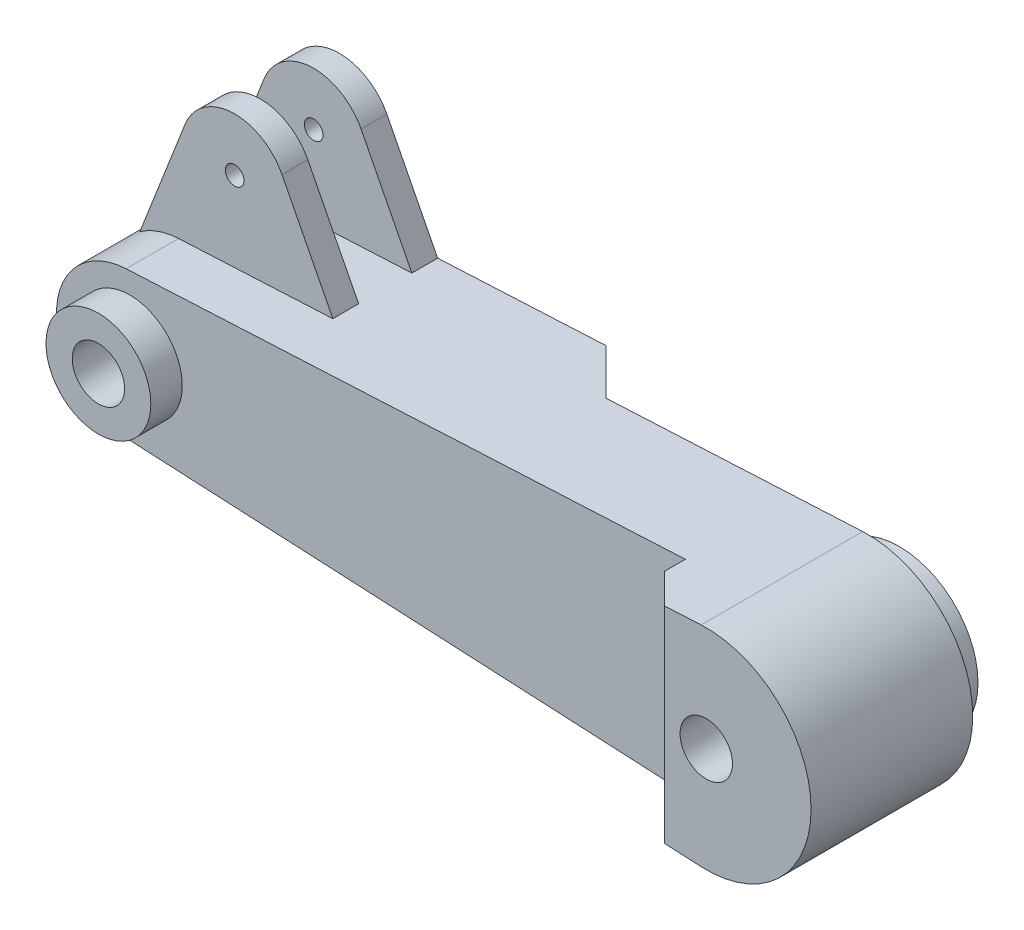
ISO-10303-21;
HEADER;
FILE_DESCRIPTION(('STEP AP214'),'2;1');
FILE_NAME('part.step','',(''),(''),'','','');
FILE_SCHEMA(('AUTOMOTIVE_DESIGN { 1 0 10303 214 1 1 1 1 }'));
ENDSEC;
DATA;
#1=APPLICATION_CONTEXT('core data for automotive mechanical design processes');
#2=APPLICATION_PROTOCOL_DEFINITION('international standard','automotive_design',2000,#1);
#3=PRODUCT_CONTEXT('',#1,'mechanical');
#4=PRODUCT('Part','Part','',(#3));
#5=PRODUCT_RELATED_PRODUCT_CATEGORY('part','',(#4));
#6=PRODUCT_DEFINITION_FORMATION('','',#4);
#7=PRODUCT_DEFINITION_CONTEXT('part definition',#1,'design');
#8=PRODUCT_DEFINITION('design','',#6,#7);
#9=PRODUCT_DEFINITION_SHAPE('','',#8);
#10=(LENGTH_UNIT() NAMED_UNIT(*) SI_UNIT(.MILLI.,.METRE.));
#11=(NAMED_UNIT(*) PLANE_ANGLE_UNIT() SI_UNIT($,.RADIAN.));
#12=(NAMED_UNIT(*) SI_UNIT($,.STERADIAN.) SOLID_ANGLE_UNIT());
#13=UNCERTAINTY_MEASURE_WITH_UNIT(LENGTH_MEASURE(1.E-05),#10,'distance_accuracy_value','');
#14=(GEOMETRIC_REPRESENTATION_CONTEXT(3) GLOBAL_UNCERTAINTY_ASSIGNED_CONTEXT((#13)) GLOBAL_UNIT_ASSIGNED_CONTEXT((#10,
#11,#12)) REPRESENTATION_CONTEXT('',''));
#15=CARTESIAN_POINT('',(0.,0.,0.));
#16=DIRECTION('',(0.,0.,1.));
#17=DIRECTION('',(1.,0.,0.));
#18=AXIS2_PLACEMENT_3D('',#15,#16,#17);
#19=CARTESIAN_POINT('',(-67.,-10.,15.));
#20=DIRECTION('',(0.,0.,-1.));
#21=DIRECTION('',(-1.,0.,0.));
#22=AXIS2_PLACEMENT_3D('',#19,#20,#21);
#23=PLANE('',#22);
#24=CARTESIAN_POINT('',(-60.,0.,15.));
#25=DIRECTION('',(0.,0.,-1.));
#26=DIRECTION('',(-1.,0.,0.));
#27=AXIS2_PLACEMENT_3D('',#24,#25,#26);
#28=CIRCLE('',#27,7.);
#29=CARTESIAN_POINT('',(-60.35,-6.99124452440336,15.));
#30=VERTEX_POINT('',#29);
#31=CARTESIAN_POINT('',(-60.35,6.99124452440336,15.));
#32=VERTEX_POINT('',#31);
#33=EDGE_CURVE('E191',#30,#32,#28,.T.);
#34=ORIENTED_EDGE('',*,*,#33,.F.);
#35=DIRECTION('',(-0.998749217771909,0.0500000000000001,0.));
#36=VECTOR('',#35,1.);
#37=CARTESIAN_POINT('',(-60.35,-6.99124452440336,15.));
#38=LINE('',#37,#36);
#39=CARTESIAN_POINT('',(-7.00000000000001,-9.66208516440995,15.));
#40=VERTEX_POINT('',#39);
#41=EDGE_CURVE('E174',#40,#30,#38,.T.);
#42=ORIENTED_EDGE('',*,*,#41,.F.);
#43=DIRECTION('',(0.,1.,0.));
#44=VECTOR('',#43,1.);
#45=CARTESIAN_POINT('',(-7.00000000000001,-10.,15.));
#46=LINE('',#45,#44);
#47=CARTESIAN_POINT('',(-7.00000000000001,9.66208516440995,15.));
#48=VERTEX_POINT('',#47);
#49=EDGE_CURVE('E188',#40,#48,#46,.T.);
#50=ORIENTED_EDGE('',*,*,#49,.T.);
#51=DIRECTION('',(0.998749217771909,0.0500000000000001,0.));
#52=VECTOR('',#51,1.);
#53=CARTESIAN_POINT('',(-60.35,6.99124452440336,15.));
#54=LINE('',#53,#52);
#55=EDGE_CURVE('E206',#32,#48,#54,.T.);
#56=ORIENTED_EDGE('',*,*,#55,.F.);
#57=EDGE_LOOP('',(#34,#42,#50,#56));
#58=FACE_BOUND('',#57,.T.);
#59=CARTESIAN_POINT('',(-60.,0.,15.));
#60=DIRECTION('',(0.,0.,-1.));
#61=DIRECTION('',(-1.,0.,0.));
#62=AXIS2_PLACEMENT_3D('',#59,#60,#61);
#63=CIRCLE('',#62,5.);
#64=CARTESIAN_POINT('',(-65.,0.,15.));
#65=VERTEX_POINT('',#64);
#66=EDGE_CURVE('E381',#65,#65,#63,.F.);
#67=ORIENTED_EDGE('',*,*,#66,.F.);
#68=EDGE_LOOP('',(#67));
#69=FACE_BOUND('',#68,.T.);
#70=ADVANCED_FACE('F51',(#58,#69),#23,.F.);
#71=CARTESIAN_POINT('',(-30.,-10.,4.572));
#72=DIRECTION('',(0.,0.,1.));
#73=DIRECTION('',(1.,0.,0.));
#74=AXIS2_PLACEMENT_3D('',#71,#72,#73);
#75=PLANE('',#74);
#76=DIRECTION('',(0.998749217771909,-0.0500000000000001,0.));
#77=VECTOR('',#76,1.);
#78=CARTESIAN_POINT('',(-60.35,-6.99124452440336,4.572));
#79=LINE('',#78,#77);
#80=CARTESIAN_POINT('',(-24.9999999999999,-8.76095805063079,4.572));
#81=VERTEX_POINT('',#80);
#82=CARTESIAN_POINT('',(-0.500000000000005,-9.98749217771909,4.572));
#83=VERTEX_POINT('',#82);
#84=EDGE_CURVE('E213',#81,#83,#79,.T.);
#85=ORIENTED_EDGE('',*,*,#84,.F.);
#86=DIRECTION('',(0.,1.,0.));
#87=VECTOR('',#86,1.);
#88=CARTESIAN_POINT('',(-24.9999999999999,8.5106449634699,4.572));
#89=LINE('',#88,#87);
#90=CARTESIAN_POINT('',(-24.9999999999999,8.76095805063079,4.572));
#91=VERTEX_POINT('',#90);
#92=EDGE_CURVE('E366',#81,#91,#89,.T.);
#93=ORIENTED_EDGE('',*,*,#92,.T.);
#94=DIRECTION('',(-0.998749217771909,-0.0500000000000001,0.));
#95=VECTOR('',#94,1.);
#96=CARTESIAN_POINT('',(-60.35,6.99124452440336,4.572));
#97=LINE('',#96,#95);
#98=CARTESIAN_POINT('',(-0.500000000000012,9.98749217771909,4.572));
#99=VERTEX_POINT('',#98);
#100=EDGE_CURVE('E183',#99,#91,#97,.T.);
#101=ORIENTED_EDGE('',*,*,#100,.F.);
#102=CARTESIAN_POINT('',(0.,0.,4.572));
#103=DIRECTION('',(0.,0.,1.));
#104=DIRECTION('',(1.,0.,0.));
#105=AXIS2_PLACEMENT_3D('',#102,#103,#104);
#106=CIRCLE('',#105,10.);
#107=EDGE_CURVE('E209',#83,#99,#106,.T.);
#108=ORIENTED_EDGE('',*,*,#107,.F.);
#109=EDGE_LOOP('',(#85,#93,#101,#108));
#110=FACE_BOUND('',#109,.T.);
#111=CARTESIAN_POINT('',(0.,0.,4.572));
#112=DIRECTION('',(0.,0.,1.));
#113=DIRECTION('',(1.,0.,0.));
#114=AXIS2_PLACEMENT_3D('',#111,#112,#113);
#115=CIRCLE('',#114,7.5);
#116=CARTESIAN_POINT('',(7.5,0.,4.572));
#117=VERTEX_POINT('',#116);
#118=EDGE_CURVE('E359',#117,#117,#115,.F.);
#119=ORIENTED_EDGE('',*,*,#118,.F.);
#120=EDGE_LOOP('',(#119));
#121=FACE_BOUND('',#120,.T.);
#122=ADVANCED_FACE('F442',(#110,#121),#75,.F.);
#123=CARTESIAN_POINT('',(-45.6302570400528,7.72815338490716,10.));
#124=DIRECTION('',(-0.890249187461966,-0.455473801906662,0.));
#125=DIRECTION('',(0.455473801906662,-0.890249187461966,0.));
#126=AXIS2_PLACEMENT_3D('',#123,#124,#125);
#127=PLANE('',#126);
#128=DIRECTION('',(0.,0.,-1.));
#129=VECTOR('',#128,1.);
#130=CARTESIAN_POINT('',(-45.6302570400528,7.72815338490716,10.));
#131=LINE('',#130,#129);
#132=CARTESIAN_POINT('',(-45.6302570400528,7.72815338490716,10.));
#133=VERTEX_POINT('',#132);
#134=CARTESIAN_POINT('',(-45.6302570400528,7.72815338490717,7.54000000000012));
#135=VERTEX_POINT('',#134);
#136=EDGE_CURVE('E299',#133,#135,#131,.T.);
#137=ORIENTED_EDGE('',*,*,#136,.T.);
#138=DIRECTION('',(-0.455473801906662,0.890249187461966,0.));
#139=VECTOR('',#138,1.);
#140=CARTESIAN_POINT('',(-45.6302570400528,7.72815338490716,7.54000000000012));
#141=LINE('',#140,#139);
#142=CARTESIAN_POINT('',(-50.4775341276932,17.2024293380149,7.54000000000012));
#143=VERTEX_POINT('',#142);
#144=EDGE_CURVE('E253',#135,#143,#141,.T.);
#145=ORIENTED_EDGE('',*,*,#144,.T.);
#146=DIRECTION('',(0.,0.,-1.));
#147=VECTOR('',#146,1.);
#148=CARTESIAN_POINT('',(-50.4775341276932,17.2024293380149,10.));
#149=LINE('',#148,#147);
#150=CARTESIAN_POINT('',(-50.4775341276932,17.2024293380149,10.));
#151=VERTEX_POINT('',#150);
#152=EDGE_CURVE('E294',#151,#143,#149,.T.);
#153=ORIENTED_EDGE('',*,*,#152,.F.);
#154=DIRECTION('',(-0.455473801906662,0.890249187461966,0.));
#155=VECTOR('',#154,1.);
#156=CARTESIAN_POINT('',(-45.6302570400528,7.72815338490716,10.));
#157=LINE('',#156,#155);
#158=EDGE_CURVE('E271',#133,#151,#157,.T.);
#159=ORIENTED_EDGE('',*,*,#158,.F.);
#160=EDGE_LOOP('',(#137,#145,#153,#159));
#161=FACE_BOUND('',#160,.T.);
#162=ADVANCED_FACE('F424',(#161),#127,.F.);
#163=CARTESIAN_POINT('',(-55.,14.8886224243291,10.));
#164=DIRECTION('',(0.,0.,-1.));
#165=DIRECTION('',(-1.,0.,0.));
#166=AXIS2_PLACEMENT_3D('',#163,#164,#165);
#167=CYLINDRICAL_SURFACE('',#166,5.08);
#168=ORIENTED_EDGE('',*,*,#152,.T.);
#169=CARTESIAN_POINT('',(-55.,14.8886224243291,7.54000000000013));
#170=DIRECTION('',(0.,0.,1.));
#171=DIRECTION('',(1.,0.,0.));
#172=AXIS2_PLACEMENT_3D('',#169,#170,#171);
#173=CIRCLE('',#172,5.08);
#174=CARTESIAN_POINT('',(-59.7309448274571,16.7391793782099,7.54000000000014));
#175=VERTEX_POINT('',#174);
#176=EDGE_CURVE('E249',#143,#175,#173,.T.);
#177=ORIENTED_EDGE('',*,*,#176,.T.);
#178=DIRECTION('',(0.,0.,-1.));
#179=VECTOR('',#178,1.);
#180=CARTESIAN_POINT('',(-59.7309448274571,16.7391793782099,10.));
#181=LINE('',#180,#179);
#182=CARTESIAN_POINT('',(-59.7309448274571,16.7391793782099,10.));
#183=VERTEX_POINT('',#182);
#184=EDGE_CURVE('E289',#183,#175,#181,.T.);
#185=ORIENTED_EDGE('',*,*,#184,.F.);
#186=CARTESIAN_POINT('',(-55.,14.8886224243291,10.));
#187=DIRECTION('',(0.,0.,1.));
#188=DIRECTION('',(1.,0.,0.));
#189=AXIS2_PLACEMENT_3D('',#186,#187,#188);
#190=CIRCLE('',#189,5.08);
#191=EDGE_CURVE('E274',#151,#183,#190,.T.);
#192=ORIENTED_EDGE('',*,*,#191,.F.);
#193=EDGE_LOOP('',(#168,#177,#185,#192));
#194=FACE_BOUND('',#193,.T.);
#195=ADVANCED_FACE('F419',(#194),#167,.T.);
#196=CARTESIAN_POINT('',(-60.,0.,20.));
#197=DIRECTION('',(0.,0.,-1.));
#198=DIRECTION('',(-1.,0.,0.));
#199=AXIS2_PLACEMENT_3D('',#196,#197,#198);
#200=CYLINDRICAL_SURFACE('',#199,7.);
#201=DIRECTION('',(0.,0.,-1.));
#202=VECTOR('',#201,1.);
#203=CARTESIAN_POINT('',(-60.35,-6.99124452440336,20.));
#204=LINE('',#203,#202);
#205=CARTESIAN_POINT('',(-60.35,-6.99124452440336,0.));
#206=VERTEX_POINT('',#205);
#207=EDGE_CURVE('E344',#30,#206,#204,.T.);
#208=ORIENTED_EDGE('',*,*,#207,.F.);
#209=ORIENTED_EDGE('',*,*,#33,.T.);
#210=DIRECTION('',(0.,0.,-1.));
#211=VECTOR('',#210,1.);
#212=CARTESIAN_POINT('',(-60.35,6.99124452440336,20.));
#213=LINE('',#212,#211);
#214=CARTESIAN_POINT('',(-60.35,6.99124452440336,10.));
#215=VERTEX_POINT('',#214);
#216=EDGE_CURVE('E325',#32,#215,#213,.T.);
#217=ORIENTED_EDGE('',*,*,#216,.T.);
#218=CARTESIAN_POINT('',(-60.,0.,10.));
#219=DIRECTION('',(0.,0.,-1.));
#220=DIRECTION('',(1.,0.,0.));
#221=AXIS2_PLACEMENT_3D('',#218,#219,#220);
#222=CIRCLE('',#221,7.);
#223=CARTESIAN_POINT('',(-64.0435617576858,5.71398357643607,10.));
#224=VERTEX_POINT('',#223);
#225=EDGE_CURVE('E262',#224,#215,#222,.T.);
#226=ORIENTED_EDGE('',*,*,#225,.F.);
#227=DIRECTION('',(0.,0.,-1.));
#228=VECTOR('',#227,1.);
#229=CARTESIAN_POINT('',(-64.0435617576858,5.71398357643607,10.));
#230=LINE('',#229,#228);
#231=CARTESIAN_POINT('',(-64.0435617576858,5.71398357643605,0.));
#232=VERTEX_POINT('',#231);
#233=EDGE_CURVE('E303',#224,#232,#230,.T.);
#234=ORIENTED_EDGE('',*,*,#233,.T.);
#235=CARTESIAN_POINT('',(-60.,0.,0.));
#236=DIRECTION('',(0.,0.,1.));
#237=DIRECTION('',(1.,0.,0.));
#238=AXIS2_PLACEMENT_3D('',#235,#236,#237);
#239=CIRCLE('',#238,7.);
#240=EDGE_CURVE('E311',#232,#206,#239,.T.);
#241=ORIENTED_EDGE('',*,*,#240,.T.);
#242=EDGE_LOOP('',(#208,#209,#217,#226,#234,#241));
#243=FACE_BOUND('',#242,.T.);
#244=ADVANCED_FACE('F411',(#243),#200,.T.);
#245=CARTESIAN_POINT('',(-60.35,6.99124452440336,20.));
#246=DIRECTION('',(0.0500000000000001,-0.998749217771909,0.));
#247=DIRECTION('',(0.998749217771909,0.0500000000000001,0.));
#248=AXIS2_PLACEMENT_3D('',#245,#246,#247);
#249=PLANE('',#248);
#250=DIRECTION('',(0.,0.,1.));
#251=VECTOR('',#250,1.);
#252=CARTESIAN_POINT('',(-7.00000000000001,9.66208516440995,20.));
#253=LINE('',#252,#251);
#254=CARTESIAN_POINT('',(-7.00000000000001,9.66208516440995,17.));
#255=VERTEX_POINT('',#254);
#256=EDGE_CURVE('E182',#48,#255,#253,.T.);
#257=ORIENTED_EDGE('',*,*,#256,.T.);
#258=DIRECTION('',(0.706664147790319,0.0353774568838614,0.706664147790316));
#259=VECTOR('',#258,1.);
#260=CARTESIAN_POINT('',(-7.49155174412314,9.63747679749579,16.5084482558769));
#261=LINE('',#260,#259);
#262=CARTESIAN_POINT('',(-3.99999999999998,9.81227301670648,20.));
#263=VERTEX_POINT('',#262);
#264=EDGE_CURVE('E75',#255,#263,#261,.T.);
#265=ORIENTED_EDGE('',*,*,#264,.T.);
#266=DIRECTION('',(-0.998749217771909,-0.0500000000000001,0.));
#267=VECTOR('',#266,1.);
#268=CARTESIAN_POINT('',(-60.35,6.99124452440336,20.));
#269=LINE('',#268,#267);
#270=CARTESIAN_POINT('',(-0.500000000000012,9.98749217771909,20.));
#271=VERTEX_POINT('',#270);
#272=EDGE_CURVE('E322',#271,#263,#269,.T.);
#273=ORIENTED_EDGE('',*,*,#272,.F.);
#274=DIRECTION('',(0.,0.,-1.));
#275=VECTOR('',#274,1.);
#276=CARTESIAN_POINT('',(-0.500000000000012,9.98749217771909,20.));
#277=LINE('',#276,#275);
#278=EDGE_CURVE('E336',#271,#99,#277,.T.);
#279=ORIENTED_EDGE('',*,*,#278,.T.);
#280=ORIENTED_EDGE('',*,*,#100,.T.);
#281=DIRECTION('',(0.706664147790321,0.0353774568838615,0.706664147790314));
#282=VECTOR('',#281,1.);
#283=CARTESIAN_POINT('',(-34.9927759699626,8.2606935301611,-5.42077596996258));
#284=LINE('',#283,#282);
#285=CARTESIAN_POINT('',(-29.572,8.53207176373088,0.));
#286=VERTEX_POINT('',#285);
#287=EDGE_CURVE('E370',#91,#286,#284,.F.);
#288=ORIENTED_EDGE('',*,*,#287,.T.);
#289=DIRECTION('',(-0.998749217771909,-0.0500000000000001,0.));
#290=VECTOR('',#289,1.);
#291=CARTESIAN_POINT('',(-60.35,6.99124452440336,0.));
#292=LINE('',#291,#290);
#293=CARTESIAN_POINT('',(-45.6302570400528,7.72815338490716,0.));
#294=VERTEX_POINT('',#293);
#295=EDGE_CURVE('E319',#286,#294,#292,.T.);
#296=ORIENTED_EDGE('',*,*,#295,.T.);
#297=CARTESIAN_POINT('',(-45.6302570400528,7.72815338490716,2.46000000000012));
#298=VERTEX_POINT('',#297);
#299=EDGE_CURVE('E298',#298,#294,#131,.T.);
#300=ORIENTED_EDGE('',*,*,#299,.F.);
#301=DIRECTION('',(0.998749217771909,0.0500000000000001,0.));
#302=VECTOR('',#301,1.);
#303=CARTESIAN_POINT('',(-67.831874608886,6.61668229818319,2.46000000000018));
#304=LINE('',#303,#302);
#305=CARTESIAN_POINT('',(-63.6077429599472,6.82815338490716,2.45999999999996));
#306=VERTEX_POINT('',#305);
#307=EDGE_CURVE('E235',#306,#298,#304,.T.);
#308=ORIENTED_EDGE('',*,*,#307,.F.);
#309=DIRECTION('',(0.,0.,-1.));
#310=VECTOR('',#309,1.);
#311=CARTESIAN_POINT('',(-63.6077429599472,6.82815338490717,10.));
#312=LINE('',#311,#310);
#313=CARTESIAN_POINT('',(-63.6077429599472,6.82815338490717,7.54000000000017));
#314=VERTEX_POINT('',#313);
#315=EDGE_CURVE('E347',#314,#306,#312,.T.);
#316=ORIENTED_EDGE('',*,*,#315,.F.);
#317=DIRECTION('',(0.998749217771909,0.0500000000000001,0.));
#318=VECTOR('',#317,1.);
#319=CARTESIAN_POINT('',(-67.831874608886,6.6166822981832,7.54000000000018));
#320=LINE('',#319,#318);
#321=EDGE_CURVE('E234',#314,#135,#320,.T.);
#322=ORIENTED_EDGE('',*,*,#321,.T.);
#323=ORIENTED_EDGE('',*,*,#136,.F.);
#324=DIRECTION('',(0.998749217771909,0.0499999999999998,0.));
#325=VECTOR('',#324,1.);
#326=CARTESIAN_POINT('',(-60.35,6.99124452440336,10.));
#327=LINE('',#326,#325);
#328=EDGE_CURVE('E267',#215,#133,#327,.T.);
#329=ORIENTED_EDGE('',*,*,#328,.F.);
#330=ORIENTED_EDGE('',*,*,#216,.F.);
#331=ORIENTED_EDGE('',*,*,#55,.T.);
#332=EDGE_LOOP('',(#257,#265,#273,#279,#280,#288,#296,#300,#308,#316,#322,#323,#329,#330,#331));
#333=FACE_BOUND('',#332,.T.);
#334=ADVANCED_FACE('F426',(#333),#249,.F.);
#335=CARTESIAN_POINT('',(-60.35,-6.99124452440336,20.));
#336=DIRECTION('',(0.0500000000000001,0.998749217771909,0.));
#337=DIRECTION('',(-0.998749217771909,0.0500000000000001,0.));
#338=AXIS2_PLACEMENT_3D('',#335,#336,#337);
#339=PLANE('',#338);
#340=DIRECTION('',(0.998749217771909,-0.0500000000000001,0.));
#341=VECTOR('',#340,1.);
#342=CARTESIAN_POINT('',(-60.35,-6.99124452440336,20.));
#343=LINE('',#342,#341);
#344=CARTESIAN_POINT('',(-3.99999999999996,-9.81227301670648,20.));
#345=VERTEX_POINT('',#344);
#346=CARTESIAN_POINT('',(-0.500000000000005,-9.98749217771909,20.));
#347=VERTEX_POINT('',#346);
#348=EDGE_CURVE('E315',#345,#347,#343,.T.);
#349=ORIENTED_EDGE('',*,*,#348,.F.);
#350=DIRECTION('',(-0.706664147790319,0.0353774568838614,-0.706664147790316));
#351=VECTOR('',#350,1.);
#352=CARTESIAN_POINT('',(-6.99155213572669,-9.66250808660718,17.0084478642733));
#353=LINE('',#352,#351);
#354=CARTESIAN_POINT('',(-7.00000000000001,-9.66208516440995,17.));
#355=VERTEX_POINT('',#354);
#356=EDGE_CURVE('E12',#345,#355,#353,.T.);
#357=ORIENTED_EDGE('',*,*,#356,.T.);
#358=DIRECTION('',(0.,0.,-1.));
#359=VECTOR('',#358,1.);
#360=CARTESIAN_POINT('',(-7.00000000000001,-9.66208516440995,20.));
#361=LINE('',#360,#359);
#362=EDGE_CURVE('E171',#355,#40,#361,.T.);
#363=ORIENTED_EDGE('',*,*,#362,.T.);
#364=ORIENTED_EDGE('',*,*,#41,.T.);
#365=ORIENTED_EDGE('',*,*,#207,.T.);
#366=DIRECTION('',(0.998749217771909,-0.0500000000000001,0.));
#367=VECTOR('',#366,1.);
#368=CARTESIAN_POINT('',(-60.35,-6.99124452440336,0.));
#369=LINE('',#368,#367);
#370=CARTESIAN_POINT('',(-29.5719999999999,-8.53207176373087,0.));
#371=VERTEX_POINT('',#370);
#372=EDGE_CURVE('E329',#206,#371,#369,.T.);
#373=ORIENTED_EDGE('',*,*,#372,.T.);
#374=DIRECTION('',(-0.706664147790321,0.0353774568838615,-0.706664147790314));
#375=VECTOR('',#374,1.);
#376=CARTESIAN_POINT('',(-34.9927759699626,-8.2606935301611,-5.42077596996257));
#377=LINE('',#376,#375);
#378=EDGE_CURVE('E378',#371,#81,#377,.F.);
#379=ORIENTED_EDGE('',*,*,#378,.T.);
#380=ORIENTED_EDGE('',*,*,#84,.T.);
#381=DIRECTION('',(0.,0.,-1.));
#382=VECTOR('',#381,1.);
#383=CARTESIAN_POINT('',(-0.500000000000005,-9.98749217771909,20.));
#384=LINE('',#383,#382);
#385=EDGE_CURVE('E340',#347,#83,#384,.T.);
#386=ORIENTED_EDGE('',*,*,#385,.F.);
#387=EDGE_LOOP('',(#349,#357,#363,#364,#365,#373,#379,#380,#386));
#388=FACE_BOUND('',#387,.T.);
#389=ADVANCED_FACE('F173',(#388),#339,.F.);
#390=CARTESIAN_POINT('',(0.,0.,20.));
#391=DIRECTION('',(0.,0.,-1.));
#392=DIRECTION('',(-1.,0.,0.));
#393=AXIS2_PLACEMENT_3D('',#390,#391,#392);
#394=CYLINDRICAL_SURFACE('',#393,10.);
#395=ORIENTED_EDGE('',*,*,#385,.T.);
#396=ORIENTED_EDGE('',*,*,#107,.T.);
#397=ORIENTED_EDGE('',*,*,#278,.F.);
#398=CARTESIAN_POINT('',(0.,0.,20.));
#399=DIRECTION('',(0.,0.,1.));
#400=DIRECTION('',(1.,0.,0.));
#401=AXIS2_PLACEMENT_3D('',#398,#399,#400);
#402=CIRCLE('',#401,10.);
#403=EDGE_CURVE('E318',#347,#271,#402,.T.);
#404=ORIENTED_EDGE('',*,*,#403,.F.);
#405=EDGE_LOOP('',(#395,#396,#397,#404));
#406=FACE_BOUND('',#405,.T.);
#407=ADVANCED_FACE('F447',(#406),#394,.T.);
#408=CARTESIAN_POINT('',(-60.,0.,20.));
#409=DIRECTION('',(0.,0.,1.));
#410=DIRECTION('',(1.,0.,0.));
#411=AXIS2_PLACEMENT_3D('',#408,#409,#410);
#412=PLANE('',#411);
#413=ORIENTED_EDGE('',*,*,#272,.T.);
#414=DIRECTION('',(0.,-1.,0.));
#415=VECTOR('',#414,1.);
#416=CARTESIAN_POINT('',(-3.99999999999998,-9.66208516440995,20.));
#417=LINE('',#416,#415);
#418=EDGE_CURVE('E61',#263,#345,#417,.T.);
#419=ORIENTED_EDGE('',*,*,#418,.T.);
#420=ORIENTED_EDGE('',*,*,#348,.T.);
#421=ORIENTED_EDGE('',*,*,#403,.T.);
#422=EDGE_LOOP('',(#413,#419,#420,#421));
#423=FACE_BOUND('',#422,.T.);
#424=CARTESIAN_POINT('',(0.,0.,20.));
#425=DIRECTION('',(0.,0.,1.));
#426=DIRECTION('',(1.,0.,0.));
#427=AXIS2_PLACEMENT_3D('',#424,#425,#426);
#428=CIRCLE('',#427,2.5);
#429=CARTESIAN_POINT('',(2.5,0.,20.));
#430=VERTEX_POINT('',#429);
#431=EDGE_CURVE('E306',#430,#430,#428,.T.);
#432=ORIENTED_EDGE('',*,*,#431,.F.);
#433=EDGE_LOOP('',(#432));
#434=FACE_BOUND('',#433,.T.);
#435=ADVANCED_FACE('F493',(#423,#434),#412,.T.);
#436=CARTESIAN_POINT('',(-60.,0.,0.));
#437=DIRECTION('',(0.,0.,1.));
#438=DIRECTION('',(1.,0.,0.));
#439=AXIS2_PLACEMENT_3D('',#436,#437,#438);
#440=PLANE('',#439);
#441=CARTESIAN_POINT('',(-55.,14.8886224243291,0.));
#442=DIRECTION('',(0.,0.,1.));
#443=DIRECTION('',(1.,0.,0.));
#444=AXIS2_PLACEMENT_3D('',#441,#442,#443);
#445=CIRCLE('',#444,0.889000000000003);
#446=CARTESIAN_POINT('',(-54.111,14.8886224243291,0.));
#447=VERTEX_POINT('',#446);
#448=EDGE_CURVE('E221',#447,#447,#445,.T.);
#449=ORIENTED_EDGE('',*,*,#448,.T.);
#450=EDGE_LOOP('',(#449));
#451=FACE_BOUND('',#450,.T.);
#452=ORIENTED_EDGE('',*,*,#295,.F.);
#453=DIRECTION('',(0.,1.,0.));
#454=VECTOR('',#453,1.);
#455=CARTESIAN_POINT('',(-29.572,0.,0.));
#456=LINE('',#455,#454);
#457=EDGE_CURVE('E374',#286,#371,#456,.F.);
#458=ORIENTED_EDGE('',*,*,#457,.T.);
#459=ORIENTED_EDGE('',*,*,#372,.F.);
#460=ORIENTED_EDGE('',*,*,#240,.F.);
#461=DIRECTION('',(-0.364282864937157,-0.931288351861644,0.));
#462=VECTOR('',#461,1.);
#463=CARTESIAN_POINT('',(-59.7309448274571,16.7391793782099,0.));
#464=LINE('',#463,#462);
#465=CARTESIAN_POINT('',(-59.7309448274571,16.7391793782099,0.));
#466=VERTEX_POINT('',#465);
#467=EDGE_CURVE('E263',#466,#232,#464,.T.);
#468=ORIENTED_EDGE('',*,*,#467,.F.);
#469=CARTESIAN_POINT('',(-55.,14.8886224243291,0.));
#470=DIRECTION('',(0.,0.,1.));
#471=DIRECTION('',(1.,0.,0.));
#472=AXIS2_PLACEMENT_3D('',#469,#470,#471);
#473=CIRCLE('',#472,5.08);
#474=CARTESIAN_POINT('',(-50.4775341276932,17.2024293380149,0.));
#475=VERTEX_POINT('',#474);
#476=EDGE_CURVE('E282',#475,#466,#473,.T.);
#477=ORIENTED_EDGE('',*,*,#476,.F.);
#478=DIRECTION('',(-0.455473801906662,0.890249187461966,0.));
#479=VECTOR('',#478,1.);
#480=CARTESIAN_POINT('',(-45.6302570400528,7.72815338490716,0.));
#481=LINE('',#480,#479);
#482=EDGE_CURVE('E257',#294,#475,#481,.T.);
#483=ORIENTED_EDGE('',*,*,#482,.F.);
#484=EDGE_LOOP('',(#452,#458,#459,#460,#468,#477,#483));
#485=FACE_BOUND('',#484,.T.);
#486=CARTESIAN_POINT('',(-60.,0.,0.));
#487=DIRECTION('',(0.,0.,1.));
#488=DIRECTION('',(1.,0.,0.));
#489=AXIS2_PLACEMENT_3D('',#486,#487,#488);
#490=CIRCLE('',#489,2.49999999999999);
#491=CARTESIAN_POINT('',(-57.5,0.,0.));
#492=VERTEX_POINT('',#491);
#493=EDGE_CURVE('E307',#492,#492,#490,.T.);
#494=ORIENTED_EDGE('',*,*,#493,.T.);
#495=EDGE_LOOP('',(#494));
#496=FACE_BOUND('',#495,.T.);
#497=ADVANCED_FACE('F407',(#451,#485,#496),#440,.F.);
#498=CARTESIAN_POINT('',(0.,0.,0.));
#499=DIRECTION('',(0.,0.,1.));
#500=DIRECTION('',(1.,0.,0.));
#501=AXIS2_PLACEMENT_3D('',#498,#499,#500);
#502=CYLINDRICAL_SURFACE('',#501,2.5);
#503=ORIENTED_EDGE('',*,*,#431,.T.);
#504=EDGE_LOOP('',(#503));
#505=FACE_BOUND('',#504,.T.);
#506=CARTESIAN_POINT('',(0.,0.,1.572));
#507=DIRECTION('',(0.,0.,-1.));
#508=DIRECTION('',(-1.,0.,0.));
#509=AXIS2_PLACEMENT_3D('',#506,#507,#508);
#510=CIRCLE('',#509,2.5);
#511=CARTESIAN_POINT('',(-2.5,0.,1.572));
#512=VERTEX_POINT('',#511);
#513=EDGE_CURVE('E200',#512,#512,#510,.T.);
#514=ORIENTED_EDGE('',*,*,#513,.T.);
#515=EDGE_LOOP('',(#514));
#516=FACE_BOUND('',#515,.T.);
#517=ADVANCED_FACE('F488',(#505,#516),#502,.F.);
#518=CARTESIAN_POINT('',(-60.,0.,0.));
#519=DIRECTION('',(0.,0.,1.));
#520=DIRECTION('',(1.,0.,0.));
#521=AXIS2_PLACEMENT_3D('',#518,#519,#520);
#522=CYLINDRICAL_SURFACE('',#521,2.49999999999999);
#523=ORIENTED_EDGE('',*,*,#493,.F.);
#524=EDGE_LOOP('',(#523));
#525=FACE_BOUND('',#524,.T.);
#526=CARTESIAN_POINT('',(-60.,0.,18.));
#527=DIRECTION('',(0.,0.,1.));
#528=DIRECTION('',(1.,0.,0.));
#529=AXIS2_PLACEMENT_3D('',#526,#527,#528);
#530=CIRCLE('',#529,2.49999999999999);
#531=CARTESIAN_POINT('',(-57.5,0.,18.));
#532=VERTEX_POINT('',#531);
#533=EDGE_CURVE('E536',#532,#532,#530,.T.);
#534=ORIENTED_EDGE('',*,*,#533,.T.);
#535=EDGE_LOOP('',(#534));
#536=FACE_BOUND('',#535,.T.);
#537=ADVANCED_FACE('F485',(#525,#536),#522,.F.);
#538=CARTESIAN_POINT('',(-50.4775341276932,17.2024293380149,2.46000000000012));
#539=VERTEX_POINT('',#538);
#540=EDGE_CURVE('E293',#539,#475,#149,.T.);
#541=ORIENTED_EDGE('',*,*,#540,.F.);
#542=DIRECTION('',(0.455473801906662,-0.890249187461966,0.));
#543=VECTOR('',#542,1.);
#544=CARTESIAN_POINT('',(-45.6302570400528,7.72815338490716,2.46000000000012));
#545=LINE('',#544,#543);
#546=EDGE_CURVE('E245',#539,#298,#545,.T.);
#547=ORIENTED_EDGE('',*,*,#546,.T.);
#548=ORIENTED_EDGE('',*,*,#299,.T.);
#549=ORIENTED_EDGE('',*,*,#482,.T.);
#550=EDGE_LOOP('',(#541,#547,#548,#549));
#551=FACE_BOUND('',#550,.T.);
#552=ADVANCED_FACE('F432',(#551),#127,.F.);
#553=CARTESIAN_POINT('',(-59.7309448274571,16.7391793782099,2.46000000000014));
#554=VERTEX_POINT('',#553);
#555=EDGE_CURVE('E278',#554,#466,#181,.T.);
#556=ORIENTED_EDGE('',*,*,#555,.F.);
#557=CARTESIAN_POINT('',(-55.,14.8886224243291,2.46000000000013));
#558=DIRECTION('',(0.,0.,-1.));
#559=DIRECTION('',(-1.,0.,0.));
#560=AXIS2_PLACEMENT_3D('',#557,#558,#559);
#561=CIRCLE('',#560,5.08);
#562=EDGE_CURVE('E238',#554,#539,#561,.T.);
#563=ORIENTED_EDGE('',*,*,#562,.T.);
#564=ORIENTED_EDGE('',*,*,#540,.T.);
#565=ORIENTED_EDGE('',*,*,#476,.T.);
#566=EDGE_LOOP('',(#556,#563,#564,#565));
#567=FACE_BOUND('',#566,.T.);
#568=ADVANCED_FACE('F402',(#567),#167,.T.);
#569=CARTESIAN_POINT('',(-59.7309448274571,16.7391793782099,10.));
#570=DIRECTION('',(0.931288351861644,-0.364282864937157,0.));
#571=DIRECTION('',(0.364282864937157,0.931288351861644,0.));
#572=AXIS2_PLACEMENT_3D('',#569,#570,#571);
#573=PLANE('',#572);
#574=ORIENTED_EDGE('',*,*,#184,.T.);
#575=DIRECTION('',(-0.364282864937157,-0.931288351861644,0.));
#576=VECTOR('',#575,1.);
#577=CARTESIAN_POINT('',(-59.7309448274571,16.7391793782099,7.54000000000014));
#578=LINE('',#577,#576);
#579=EDGE_CURVE('E355',#175,#314,#578,.T.);
#580=ORIENTED_EDGE('',*,*,#579,.T.);
#581=ORIENTED_EDGE('',*,*,#315,.T.);
#582=DIRECTION('',(0.364282864937157,0.931288351861644,0.));
#583=VECTOR('',#582,1.);
#584=CARTESIAN_POINT('',(-59.7309448274572,16.7391793782098,2.46000000000014));
#585=LINE('',#584,#583);
#586=EDGE_CURVE('E351',#306,#554,#585,.T.);
#587=ORIENTED_EDGE('',*,*,#586,.T.);
#588=ORIENTED_EDGE('',*,*,#555,.T.);
#589=ORIENTED_EDGE('',*,*,#467,.T.);
#590=ORIENTED_EDGE('',*,*,#233,.F.);
#591=DIRECTION('',(-0.364282864937145,-0.931288351861649,0.));
#592=VECTOR('',#591,1.);
#593=CARTESIAN_POINT('',(-63.6077429599472,6.82815338490716,10.));
#594=LINE('',#593,#592);
#595=EDGE_CURVE('E258',#183,#224,#594,.T.);
#596=ORIENTED_EDGE('',*,*,#595,.F.);
#597=EDGE_LOOP('',(#574,#580,#581,#587,#588,#589,#590,#596));
#598=FACE_BOUND('',#597,.T.);
#599=ADVANCED_FACE('F396',(#598),#573,.F.);
#600=CARTESIAN_POINT('',(-60.,0.,10.));
#601=DIRECTION('',(0.,0.,1.));
#602=DIRECTION('',(1.,0.,0.));
#603=AXIS2_PLACEMENT_3D('',#600,#601,#602);
#604=PLANE('',#603);
#605=CARTESIAN_POINT('',(-55.,14.8886224243291,10.));
#606=DIRECTION('',(0.,0.,1.));
#607=DIRECTION('',(1.,0.,0.));
#608=AXIS2_PLACEMENT_3D('',#605,#606,#607);
#609=CIRCLE('',#608,0.889000000000003);
#610=CARTESIAN_POINT('',(-54.111,14.8886224243291,10.));
#611=VERTEX_POINT('',#610);
#612=EDGE_CURVE('E230',#611,#611,#609,.T.);
#613=ORIENTED_EDGE('',*,*,#612,.F.);
#614=EDGE_LOOP('',(#613));
#615=FACE_BOUND('',#614,.T.);
#616=ORIENTED_EDGE('',*,*,#595,.T.);
#617=ORIENTED_EDGE('',*,*,#225,.T.);
#618=ORIENTED_EDGE('',*,*,#328,.T.);
#619=ORIENTED_EDGE('',*,*,#158,.T.);
#620=ORIENTED_EDGE('',*,*,#191,.T.);
#621=EDGE_LOOP('',(#616,#617,#618,#619,#620));
#622=FACE_BOUND('',#621,.T.);
#623=ADVANCED_FACE('F415',(#615,#622),#604,.T.);
#624=CARTESIAN_POINT('',(-67.831874608886,6.6166822981832,7.54000000000018));
#625=DIRECTION('',(0.,0.,1.));
#626=DIRECTION('',(1.,0.,0.));
#627=AXIS2_PLACEMENT_3D('',#624,#625,#626);
#628=PLANE('',#627);
#629=CARTESIAN_POINT('',(-55.,14.8886224243291,7.54000000000013));
#630=DIRECTION('',(0.,0.,1.));
#631=DIRECTION('',(1.,0.,0.));
#632=AXIS2_PLACEMENT_3D('',#629,#630,#631);
#633=CIRCLE('',#632,0.889000000000003);
#634=CARTESIAN_POINT('',(-54.111,14.8886224243291,7.54000000000013));
#635=VERTEX_POINT('',#634);
#636=EDGE_CURVE('E226',#635,#635,#633,.T.);
#637=ORIENTED_EDGE('',*,*,#636,.T.);
#638=EDGE_LOOP('',(#637));
#639=FACE_BOUND('',#638,.T.);
#640=ORIENTED_EDGE('',*,*,#321,.F.);
#641=ORIENTED_EDGE('',*,*,#579,.F.);
#642=ORIENTED_EDGE('',*,*,#176,.F.);
#643=ORIENTED_EDGE('',*,*,#144,.F.);
#644=EDGE_LOOP('',(#640,#641,#642,#643));
#645=FACE_BOUND('',#644,.T.);
#646=ADVANCED_FACE('F422',(#639,#645),#628,.F.);
#647=CARTESIAN_POINT('',(-67.831874608886,6.61668229818319,2.46000000000018));
#648=DIRECTION('',(0.,0.,-1.));
#649=DIRECTION('',(-1.,0.,0.));
#650=AXIS2_PLACEMENT_3D('',#647,#648,#649);
#651=PLANE('',#650);
#652=CARTESIAN_POINT('',(-55.,14.8886224243291,2.46000000000013));
#653=DIRECTION('',(0.,0.,-1.));
#654=DIRECTION('',(-1.,0.,0.));
#655=AXIS2_PLACEMENT_3D('',#652,#653,#654);
#656=CIRCLE('',#655,0.889000000000003);
#657=CARTESIAN_POINT('',(-55.889,14.8886224243291,2.46000000000014));
#658=VERTEX_POINT('',#657);
#659=EDGE_CURVE('E225',#658,#658,#656,.T.);
#660=ORIENTED_EDGE('',*,*,#659,.T.);
#661=EDGE_LOOP('',(#660));
#662=FACE_BOUND('',#661,.T.);
#663=ORIENTED_EDGE('',*,*,#562,.F.);
#664=ORIENTED_EDGE('',*,*,#586,.F.);
#665=ORIENTED_EDGE('',*,*,#307,.T.);
#666=ORIENTED_EDGE('',*,*,#546,.F.);
#667=EDGE_LOOP('',(#663,#664,#665,#666));
#668=FACE_BOUND('',#667,.T.);
#669=ADVANCED_FACE('F430',(#662,#668),#651,.F.);
#670=CARTESIAN_POINT('',(-55.,14.8886224243291,0.));
#671=DIRECTION('',(0.,0.,1.));
#672=DIRECTION('',(1.,0.,0.));
#673=AXIS2_PLACEMENT_3D('',#670,#671,#672);
#674=CYLINDRICAL_SURFACE('',#673,0.889000000000003);
#675=ORIENTED_EDGE('',*,*,#448,.F.);
#676=EDGE_LOOP('',(#675));
#677=FACE_BOUND('',#676,.T.);
#678=ORIENTED_EDGE('',*,*,#659,.F.);
#679=EDGE_LOOP('',(#678));
#680=FACE_BOUND('',#679,.T.);
#681=ADVANCED_FACE('F468',(#677,#680),#674,.F.);
#682=ORIENTED_EDGE('',*,*,#612,.T.);
#683=EDGE_LOOP('',(#682));
#684=FACE_BOUND('',#683,.T.);
#685=ORIENTED_EDGE('',*,*,#636,.F.);
#686=EDGE_LOOP('',(#685));
#687=FACE_BOUND('',#686,.T.);
#688=ADVANCED_FACE('F465',(#684,#687),#674,.F.);
#689=CARTESIAN_POINT('',(-7.00000000000001,-10.,15.));
#690=DIRECTION('',(1.,0.,0.));
#691=DIRECTION('',(0.,0.,-1.));
#692=AXIS2_PLACEMENT_3D('',#689,#690,#691);
#693=PLANE('',#692);
#694=ORIENTED_EDGE('',*,*,#362,.F.);
#695=DIRECTION('',(0.,1.,0.));
#696=VECTOR('',#695,1.);
#697=CARTESIAN_POINT('',(-7.00000000000001,9.66208516440995,17.));
#698=LINE('',#697,#696);
#699=EDGE_CURVE('E385',#355,#255,#698,.T.);
#700=ORIENTED_EDGE('',*,*,#699,.T.);
#701=ORIENTED_EDGE('',*,*,#256,.F.);
#702=ORIENTED_EDGE('',*,*,#49,.F.);
#703=EDGE_LOOP('',(#694,#700,#701,#702));
#704=FACE_BOUND('',#703,.T.);
#705=ADVANCED_FACE('F194',(#704),#693,.F.);
#706=CARTESIAN_POINT('',(0.,0.,1.572));
#707=DIRECTION('',(0.,0.,-1.));
#708=DIRECTION('',(-1.,0.,0.));
#709=AXIS2_PLACEMENT_3D('',#706,#707,#708);
#710=PLANE('',#709);
#711=CARTESIAN_POINT('',(0.,0.,1.572));
#712=DIRECTION('',(0.,0.,-1.));
#713=DIRECTION('',(-1.,0.,0.));
#714=AXIS2_PLACEMENT_3D('',#711,#712,#713);
#715=CIRCLE('',#714,7.5);
#716=CARTESIAN_POINT('',(-7.5,0.,1.572));
#717=VERTEX_POINT('',#716);
#718=EDGE_CURVE('E196',#717,#717,#715,.T.);
#719=ORIENTED_EDGE('',*,*,#718,.T.);
#720=EDGE_LOOP('',(#719));
#721=FACE_BOUND('',#720,.T.);
#722=ORIENTED_EDGE('',*,*,#513,.F.);
#723=EDGE_LOOP('',(#722));
#724=FACE_BOUND('',#723,.T.);
#725=ADVANCED_FACE('F517',(#721,#724),#710,.T.);
#726=CARTESIAN_POINT('',(0.,0.,1.572));
#727=DIRECTION('',(0.,0.,1.));
#728=DIRECTION('',(1.,0.,0.));
#729=AXIS2_PLACEMENT_3D('',#726,#727,#728);
#730=CYLINDRICAL_SURFACE('',#729,7.5);
#731=ORIENTED_EDGE('',*,*,#718,.F.);
#732=EDGE_LOOP('',(#731));
#733=FACE_BOUND('',#732,.T.);
#734=ORIENTED_EDGE('',*,*,#118,.T.);
#735=EDGE_LOOP('',(#734));
#736=FACE_BOUND('',#735,.T.);
#737=ADVANCED_FACE('F510',(#733,#736),#730,.T.);
#738=CARTESIAN_POINT('',(-24.9999999999999,-10.,4.572));
#739=DIRECTION('',(0.707106781186544,0.,-0.707106781186551));
#740=DIRECTION('',(0.,-1.,0.));
#741=AXIS2_PLACEMENT_3D('',#738,#739,#740);
#742=PLANE('',#741);
#743=ORIENTED_EDGE('',*,*,#378,.F.);
#744=ORIENTED_EDGE('',*,*,#457,.F.);
#745=ORIENTED_EDGE('',*,*,#287,.F.);
#746=ORIENTED_EDGE('',*,*,#92,.F.);
#747=EDGE_LOOP('',(#743,#744,#745,#746));
#748=FACE_BOUND('',#747,.T.);
#749=ADVANCED_FACE('F437',(#748),#742,.T.);
#750=CARTESIAN_POINT('',(-60.,0.,18.));
#751=DIRECTION('',(0.,0.,1.));
#752=DIRECTION('',(1.,0.,0.));
#753=AXIS2_PLACEMENT_3D('',#750,#751,#752);
#754=PLANE('',#753);
#755=CARTESIAN_POINT('',(-60.,0.,18.));
#756=DIRECTION('',(0.,0.,1.));
#757=DIRECTION('',(1.,0.,0.));
#758=AXIS2_PLACEMENT_3D('',#755,#756,#757);
#759=CIRCLE('',#758,5.);
#760=CARTESIAN_POINT('',(-55.,0.,18.));
#761=VERTEX_POINT('',#760);
#762=EDGE_CURVE('E533',#761,#761,#759,.T.);
#763=ORIENTED_EDGE('',*,*,#762,.T.);
#764=EDGE_LOOP('',(#763));
#765=FACE_BOUND('',#764,.T.);
#766=ORIENTED_EDGE('',*,*,#533,.F.);
#767=EDGE_LOOP('',(#766));
#768=FACE_BOUND('',#767,.T.);
#769=ADVANCED_FACE('F454',(#765,#768),#754,.T.);
#770=CARTESIAN_POINT('',(-60.,0.,18.));
#771=DIRECTION('',(0.,0.,-1.));
#772=DIRECTION('',(-1.,0.,0.));
#773=AXIS2_PLACEMENT_3D('',#770,#771,#772);
#774=CYLINDRICAL_SURFACE('',#773,5.);
#775=ORIENTED_EDGE('',*,*,#762,.F.);
#776=EDGE_LOOP('',(#775));
#777=FACE_BOUND('',#776,.T.);
#778=ORIENTED_EDGE('',*,*,#66,.T.);
#779=EDGE_LOOP('',(#778));
#780=FACE_BOUND('',#779,.T.);
#781=ADVANCED_FACE('F450',(#777,#780),#774,.T.);
#782=CARTESIAN_POINT('',(-7.00000000000001,-10.,17.));
#783=DIRECTION('',(-0.707106781186546,0.,0.707106781186549));
#784=DIRECTION('',(0.,-1.,0.));
#785=AXIS2_PLACEMENT_3D('',#782,#783,#784);
#786=PLANE('',#785);
#787=ORIENTED_EDGE('',*,*,#356,.F.);
#788=ORIENTED_EDGE('',*,*,#418,.F.);
#789=ORIENTED_EDGE('',*,*,#264,.F.);
#790=ORIENTED_EDGE('',*,*,#699,.F.);
#791=EDGE_LOOP('',(#787,#788,#789,#790));
#792=FACE_BOUND('',#791,.T.);
#793=ADVANCED_FACE('F54',(#792),#786,.T.);
#794=CLOSED_SHELL('',(#70,#122,#162,#195,#244,#334,#389,#407,#435,#497,#517,#537,#552,#568,#599,
#623,#646,#669,#681,#688,#705,#725,#737,#749,#769,#781,#793));
#795=MANIFOLD_SOLID_BREP('B2',#794);
#796=ADVANCED_BREP_SHAPE_REPRESENTATION('',(#18,#795),#14);
#797=SHAPE_DEFINITION_REPRESENTATION(#9,#796);
ENDSEC;
END-ISO-10303-21;
